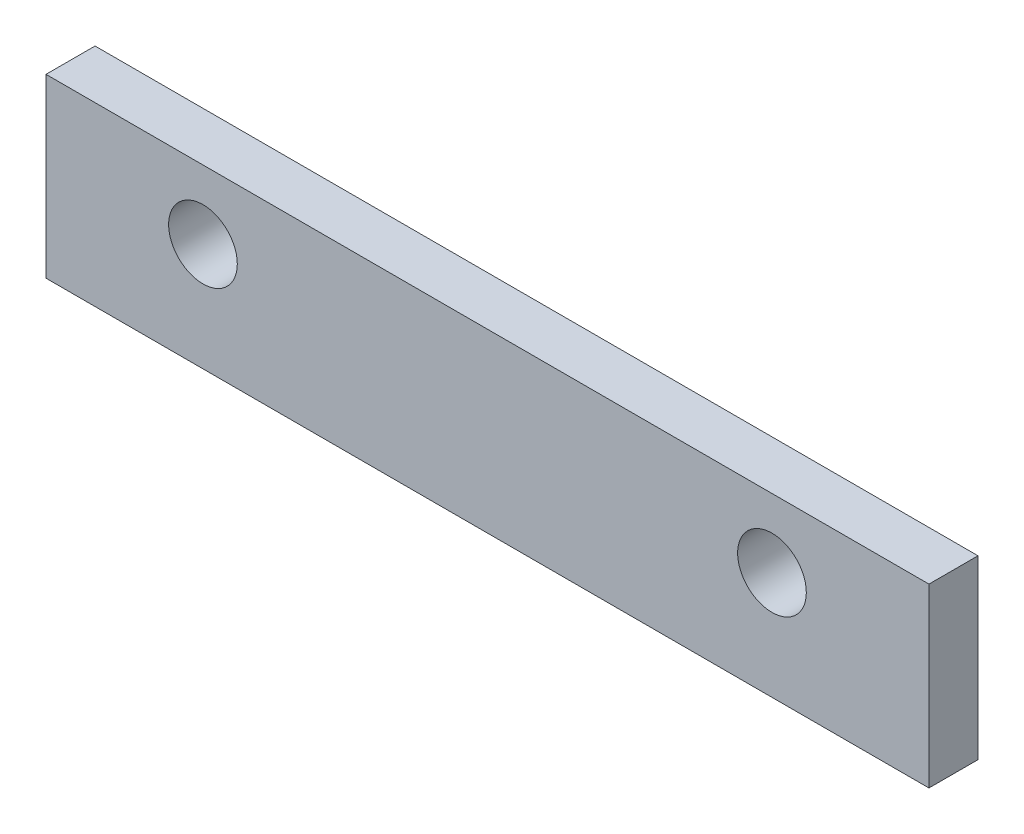
ISO-10303-21;
HEADER;
FILE_DESCRIPTION(('STEP AP214'),'2;1');
FILE_NAME('part.step','',(''),(''),'','','');
FILE_SCHEMA(('AUTOMOTIVE_DESIGN { 1 0 10303 214 1 1 1 1 }'));
ENDSEC;
DATA;
#1=APPLICATION_CONTEXT('core data for automotive mechanical design processes');
#2=APPLICATION_PROTOCOL_DEFINITION('international standard','automotive_design',2000,#1);
#3=PRODUCT_CONTEXT('',#1,'mechanical');
#4=PRODUCT('Part','Part','',(#3));
#5=PRODUCT_RELATED_PRODUCT_CATEGORY('part','',(#4));
#6=PRODUCT_DEFINITION_FORMATION('','',#4);
#7=PRODUCT_DEFINITION_CONTEXT('part definition',#1,'design');
#8=PRODUCT_DEFINITION('design','',#6,#7);
#9=PRODUCT_DEFINITION_SHAPE('','',#8);
#10=(LENGTH_UNIT() NAMED_UNIT(*) SI_UNIT(.MILLI.,.METRE.));
#11=(NAMED_UNIT(*) PLANE_ANGLE_UNIT() SI_UNIT($,.RADIAN.));
#12=(NAMED_UNIT(*) SI_UNIT($,.STERADIAN.) SOLID_ANGLE_UNIT());
#13=UNCERTAINTY_MEASURE_WITH_UNIT(LENGTH_MEASURE(1.E-05),#10,'distance_accuracy_value','');
#14=(GEOMETRIC_REPRESENTATION_CONTEXT(3) GLOBAL_UNCERTAINTY_ASSIGNED_CONTEXT((#13)) GLOBAL_UNIT_ASSIGNED_CONTEXT((#10,
#11,#12)) REPRESENTATION_CONTEXT('',''));
#15=CARTESIAN_POINT('',(0.,0.,0.));
#16=DIRECTION('',(0.,0.,1.));
#17=DIRECTION('',(1.,0.,0.));
#18=AXIS2_PLACEMENT_3D('',#15,#16,#17);
#19=CARTESIAN_POINT('',(0.,0.,2.5));
#20=DIRECTION('',(0.,0.,1.));
#21=DIRECTION('',(1.,0.,0.));
#22=AXIS2_PLACEMENT_3D('',#19,#20,#21);
#23=PLANE('',#22);
#24=CARTESIAN_POINT('',(-14.5,1.,2.5));
#25=DIRECTION('',(0.,0.,1.));
#26=DIRECTION('',(1.,0.,0.));
#27=AXIS2_PLACEMENT_3D('',#24,#25,#26);
#28=CIRCLE('',#27,1.75);
#29=CARTESIAN_POINT('',(-12.75,1.,2.5));
#30=VERTEX_POINT('',#29);
#31=EDGE_CURVE('E112',#30,#30,#28,.T.);
#32=ORIENTED_EDGE('',*,*,#31,.F.);
#33=EDGE_LOOP('',(#32));
#34=FACE_BOUND('',#33,.T.);
#35=DIRECTION('',(0.,-1.,0.));
#36=VECTOR('',#35,1.);
#37=CARTESIAN_POINT('',(-22.5,4.5,2.5));
#38=LINE('',#37,#36);
#39=CARTESIAN_POINT('',(-22.5,4.5,2.5));
#40=VERTEX_POINT('',#39);
#41=CARTESIAN_POINT('',(-22.5,-4.5,2.5));
#42=VERTEX_POINT('',#41);
#43=EDGE_CURVE('E92',#40,#42,#38,.T.);
#44=ORIENTED_EDGE('',*,*,#43,.T.);
#45=DIRECTION('',(1.,0.,0.));
#46=VECTOR('',#45,1.);
#47=CARTESIAN_POINT('',(-22.5,-4.5,2.5));
#48=LINE('',#47,#46);
#49=CARTESIAN_POINT('',(22.5,-4.5,2.5));
#50=VERTEX_POINT('',#49);
#51=EDGE_CURVE('E87',#42,#50,#48,.T.);
#52=ORIENTED_EDGE('',*,*,#51,.T.);
#53=DIRECTION('',(0.,1.,0.));
#54=VECTOR('',#53,1.);
#55=CARTESIAN_POINT('',(22.5,4.5,2.5));
#56=LINE('',#55,#54);
#57=CARTESIAN_POINT('',(22.5,4.5,2.5));
#58=VERTEX_POINT('',#57);
#59=EDGE_CURVE('E90',#50,#58,#56,.T.);
#60=ORIENTED_EDGE('',*,*,#59,.T.);
#61=DIRECTION('',(-1.,0.,0.));
#62=VECTOR('',#61,1.);
#63=CARTESIAN_POINT('',(-22.5,4.5,2.5));
#64=LINE('',#63,#62);
#65=EDGE_CURVE('E57',#58,#40,#64,.T.);
#66=ORIENTED_EDGE('',*,*,#65,.T.);
#67=EDGE_LOOP('',(#44,#52,#60,#66));
#68=FACE_BOUND('',#67,.T.);
#69=CARTESIAN_POINT('',(14.5,1.,2.5));
#70=DIRECTION('',(0.,0.,1.));
#71=DIRECTION('',(1.,0.,0.));
#72=AXIS2_PLACEMENT_3D('',#69,#70,#71);
#73=CIRCLE('',#72,1.75);
#74=CARTESIAN_POINT('',(16.25,1.,2.5));
#75=VERTEX_POINT('',#74);
#76=EDGE_CURVE('E134',#75,#75,#73,.T.);
#77=ORIENTED_EDGE('',*,*,#76,.F.);
#78=EDGE_LOOP('',(#77));
#79=FACE_BOUND('',#78,.T.);
#80=ADVANCED_FACE('F39',(#34,#68,#79),#23,.T.);
#81=CARTESIAN_POINT('',(0.,0.,0.));
#82=DIRECTION('',(0.,0.,1.));
#83=DIRECTION('',(1.,0.,0.));
#84=AXIS2_PLACEMENT_3D('',#81,#82,#83);
#85=PLANE('',#84);
#86=DIRECTION('',(0.,-1.,0.));
#87=VECTOR('',#86,1.);
#88=CARTESIAN_POINT('',(-22.5,4.5,0.));
#89=LINE('',#88,#87);
#90=CARTESIAN_POINT('',(-22.5,4.5,0.));
#91=VERTEX_POINT('',#90);
#92=CARTESIAN_POINT('',(-22.5,-4.5,0.));
#93=VERTEX_POINT('',#92);
#94=EDGE_CURVE('E108',#91,#93,#89,.T.);
#95=ORIENTED_EDGE('',*,*,#94,.F.);
#96=DIRECTION('',(-1.,0.,0.));
#97=VECTOR('',#96,1.);
#98=CARTESIAN_POINT('',(-22.5,4.5,0.));
#99=LINE('',#98,#97);
#100=CARTESIAN_POINT('',(22.5,4.5,0.));
#101=VERTEX_POINT('',#100);
#102=EDGE_CURVE('E80',#101,#91,#99,.T.);
#103=ORIENTED_EDGE('',*,*,#102,.F.);
#104=DIRECTION('',(0.,1.,0.));
#105=VECTOR('',#104,1.);
#106=CARTESIAN_POINT('',(22.5,4.5,0.));
#107=LINE('',#106,#105);
#108=CARTESIAN_POINT('',(22.5,-4.5,0.));
#109=VERTEX_POINT('',#108);
#110=EDGE_CURVE('E74',#109,#101,#107,.T.);
#111=ORIENTED_EDGE('',*,*,#110,.F.);
#112=DIRECTION('',(1.,0.,0.));
#113=VECTOR('',#112,1.);
#114=CARTESIAN_POINT('',(-22.5,-4.5,0.));
#115=LINE('',#114,#113);
#116=EDGE_CURVE('E97',#93,#109,#115,.T.);
#117=ORIENTED_EDGE('',*,*,#116,.F.);
#118=EDGE_LOOP('',(#95,#103,#111,#117));
#119=FACE_BOUND('',#118,.T.);
#120=CARTESIAN_POINT('',(-14.5,1.,0.));
#121=DIRECTION('',(0.,0.,1.));
#122=DIRECTION('',(1.,0.,0.));
#123=AXIS2_PLACEMENT_3D('',#120,#121,#122);
#124=CIRCLE('',#123,1.75);
#125=CARTESIAN_POINT('',(-12.75,1.,0.));
#126=VERTEX_POINT('',#125);
#127=EDGE_CURVE('E130',#126,#126,#124,.T.);
#128=ORIENTED_EDGE('',*,*,#127,.T.);
#129=EDGE_LOOP('',(#128));
#130=FACE_BOUND('',#129,.T.);
#131=CARTESIAN_POINT('',(14.5,1.,0.));
#132=DIRECTION('',(0.,0.,1.));
#133=DIRECTION('',(1.,0.,0.));
#134=AXIS2_PLACEMENT_3D('',#131,#132,#133);
#135=CIRCLE('',#134,1.75);
#136=CARTESIAN_POINT('',(16.25,1.,0.));
#137=VERTEX_POINT('',#136);
#138=EDGE_CURVE('E138',#137,#137,#135,.T.);
#139=ORIENTED_EDGE('',*,*,#138,.T.);
#140=EDGE_LOOP('',(#139));
#141=FACE_BOUND('',#140,.T.);
#142=ADVANCED_FACE('F125',(#119,#130,#141),#85,.F.);
#143=CARTESIAN_POINT('',(-22.5,4.5,2.5));
#144=DIRECTION('',(1.,0.,0.));
#145=DIRECTION('',(0.,0.,-1.));
#146=AXIS2_PLACEMENT_3D('',#143,#144,#145);
#147=PLANE('',#146);
#148=ORIENTED_EDGE('',*,*,#94,.T.);
#149=DIRECTION('',(0.,0.,-1.));
#150=VECTOR('',#149,1.);
#151=CARTESIAN_POINT('',(-22.5,-4.5,2.5));
#152=LINE('',#151,#150);
#153=EDGE_CURVE('E11',#42,#93,#152,.T.);
#154=ORIENTED_EDGE('',*,*,#153,.F.);
#155=ORIENTED_EDGE('',*,*,#43,.F.);
#156=DIRECTION('',(0.,0.,-1.));
#157=VECTOR('',#156,1.);
#158=CARTESIAN_POINT('',(-22.5,4.5,2.5));
#159=LINE('',#158,#157);
#160=EDGE_CURVE('E104',#40,#91,#159,.T.);
#161=ORIENTED_EDGE('',*,*,#160,.T.);
#162=EDGE_LOOP('',(#148,#154,#155,#161));
#163=FACE_BOUND('',#162,.T.);
#164=ADVANCED_FACE('F41',(#163),#147,.F.);
#165=CARTESIAN_POINT('',(-22.5,-4.5,2.5));
#166=DIRECTION('',(0.,1.,0.));
#167=DIRECTION('',(-1.,0.,0.));
#168=AXIS2_PLACEMENT_3D('',#165,#166,#167);
#169=PLANE('',#168);
#170=ORIENTED_EDGE('',*,*,#116,.T.);
#171=DIRECTION('',(0.,0.,-1.));
#172=VECTOR('',#171,1.);
#173=CARTESIAN_POINT('',(22.5,-4.5,2.5));
#174=LINE('',#173,#172);
#175=EDGE_CURVE('E49',#50,#109,#174,.T.);
#176=ORIENTED_EDGE('',*,*,#175,.F.);
#177=ORIENTED_EDGE('',*,*,#51,.F.);
#178=ORIENTED_EDGE('',*,*,#153,.T.);
#179=EDGE_LOOP('',(#170,#176,#177,#178));
#180=FACE_BOUND('',#179,.T.);
#181=ADVANCED_FACE('F96',(#180),#169,.F.);
#182=CARTESIAN_POINT('',(22.5,4.5,2.5));
#183=DIRECTION('',(-1.,0.,0.));
#184=DIRECTION('',(0.,0.,1.));
#185=AXIS2_PLACEMENT_3D('',#182,#183,#184);
#186=PLANE('',#185);
#187=ORIENTED_EDGE('',*,*,#110,.T.);
#188=DIRECTION('',(0.,0.,-1.));
#189=VECTOR('',#188,1.);
#190=CARTESIAN_POINT('',(22.5,4.5,2.5));
#191=LINE('',#190,#189);
#192=EDGE_CURVE('E99',#58,#101,#191,.T.);
#193=ORIENTED_EDGE('',*,*,#192,.F.);
#194=ORIENTED_EDGE('',*,*,#59,.F.);
#195=ORIENTED_EDGE('',*,*,#175,.T.);
#196=EDGE_LOOP('',(#187,#193,#194,#195));
#197=FACE_BOUND('',#196,.T.);
#198=ADVANCED_FACE('F100',(#197),#186,.F.);
#199=CARTESIAN_POINT('',(-22.5,4.5,2.5));
#200=DIRECTION('',(0.,-1.,0.));
#201=DIRECTION('',(1.,0.,0.));
#202=AXIS2_PLACEMENT_3D('',#199,#200,#201);
#203=PLANE('',#202);
#204=ORIENTED_EDGE('',*,*,#102,.T.);
#205=ORIENTED_EDGE('',*,*,#160,.F.);
#206=ORIENTED_EDGE('',*,*,#65,.F.);
#207=ORIENTED_EDGE('',*,*,#192,.T.);
#208=EDGE_LOOP('',(#204,#205,#206,#207));
#209=FACE_BOUND('',#208,.T.);
#210=ADVANCED_FACE('F122',(#209),#203,.F.);
#211=CARTESIAN_POINT('',(-14.5,1.,2.5));
#212=DIRECTION('',(0.,0.,-1.));
#213=DIRECTION('',(-1.,0.,0.));
#214=AXIS2_PLACEMENT_3D('',#211,#212,#213);
#215=CYLINDRICAL_SURFACE('',#214,1.75);
#216=ORIENTED_EDGE('',*,*,#31,.T.);
#217=EDGE_LOOP('',(#216));
#218=FACE_BOUND('',#217,.T.);
#219=ORIENTED_EDGE('',*,*,#127,.F.);
#220=EDGE_LOOP('',(#219));
#221=FACE_BOUND('',#220,.T.);
#222=ADVANCED_FACE('F157',(#218,#221),#215,.F.);
#223=CARTESIAN_POINT('',(14.5,1.,2.5));
#224=DIRECTION('',(0.,0.,-1.));
#225=DIRECTION('',(-1.,0.,0.));
#226=AXIS2_PLACEMENT_3D('',#223,#224,#225);
#227=CYLINDRICAL_SURFACE('',#226,1.75);
#228=ORIENTED_EDGE('',*,*,#76,.T.);
#229=EDGE_LOOP('',(#228));
#230=FACE_BOUND('',#229,.T.);
#231=ORIENTED_EDGE('',*,*,#138,.F.);
#232=EDGE_LOOP('',(#231));
#233=FACE_BOUND('',#232,.T.);
#234=ADVANCED_FACE('F146',(#230,#233),#227,.F.);
#235=CLOSED_SHELL('',(#80,#142,#164,#181,#198,#210,#222,#234));
#236=MANIFOLD_SOLID_BREP('B2',#235);
#237=ADVANCED_BREP_SHAPE_REPRESENTATION('',(#18,#236),#14);
#238=SHAPE_DEFINITION_REPRESENTATION(#9,#237);
ENDSEC;
END-ISO-10303-21;
